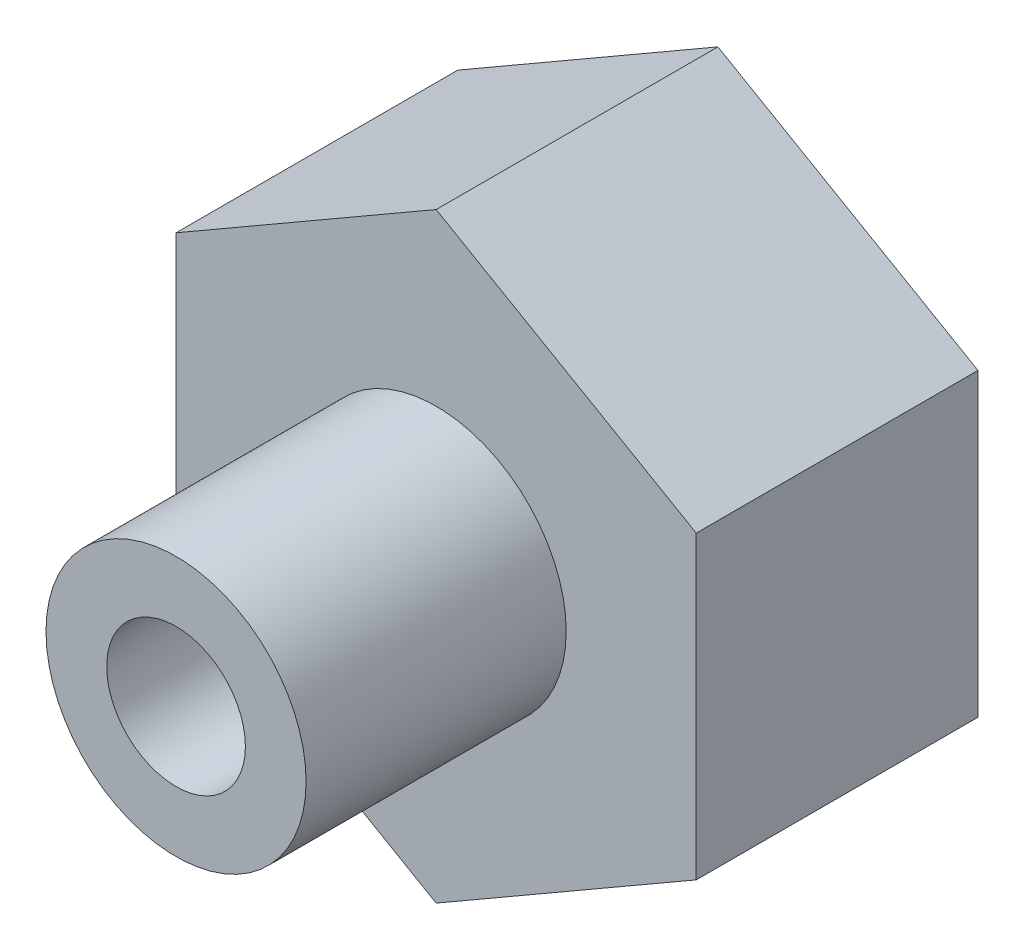
ISO-10303-21;
HEADER;
FILE_DESCRIPTION(('STEP AP214'),'2;1');
FILE_NAME('part.step','',(''),(''),'','','');
FILE_SCHEMA(('AUTOMOTIVE_DESIGN { 1 0 10303 214 1 1 1 1 }'));
ENDSEC;
DATA;
#1=APPLICATION_CONTEXT('core data for automotive mechanical design processes');
#2=APPLICATION_PROTOCOL_DEFINITION('international standard','automotive_design',2000,#1);
#3=PRODUCT_CONTEXT('',#1,'mechanical');
#4=PRODUCT('Part','Part','',(#3));
#5=PRODUCT_RELATED_PRODUCT_CATEGORY('part','',(#4));
#6=PRODUCT_DEFINITION_FORMATION('','',#4);
#7=PRODUCT_DEFINITION_CONTEXT('part definition',#1,'design');
#8=PRODUCT_DEFINITION('design','',#6,#7);
#9=PRODUCT_DEFINITION_SHAPE('','',#8);
#10=(LENGTH_UNIT() NAMED_UNIT(*) SI_UNIT(.MILLI.,.METRE.));
#11=(NAMED_UNIT(*) PLANE_ANGLE_UNIT() SI_UNIT($,.RADIAN.));
#12=(NAMED_UNIT(*) SI_UNIT($,.STERADIAN.) SOLID_ANGLE_UNIT());
#13=UNCERTAINTY_MEASURE_WITH_UNIT(LENGTH_MEASURE(1.E-05),#10,'distance_accuracy_value','');
#14=(GEOMETRIC_REPRESENTATION_CONTEXT(3) GLOBAL_UNCERTAINTY_ASSIGNED_CONTEXT((#13)) GLOBAL_UNIT_ASSIGNED_CONTEXT((#10,
#11,#12)) REPRESENTATION_CONTEXT('',''));
#15=CARTESIAN_POINT('',(0.,0.,0.));
#16=DIRECTION('',(0.,0.,1.));
#17=DIRECTION('',(1.,0.,0.));
#18=AXIS2_PLACEMENT_3D('',#15,#16,#17);
#19=CARTESIAN_POINT('',(12.,-6.92820323027552,13.));
#20=DIRECTION('',(-1.,0.,0.));
#21=DIRECTION('',(0.,-1.,0.));
#22=AXIS2_PLACEMENT_3D('',#19,#20,#21);
#23=PLANE('',#22);
#24=DIRECTION('',(0.,1.,0.));
#25=VECTOR('',#24,1.);
#26=CARTESIAN_POINT('',(12.,-6.92820323027552,0.));
#27=LINE('',#26,#25);
#28=CARTESIAN_POINT('',(12.,-6.92820323027552,0.));
#29=VERTEX_POINT('',#28);
#30=CARTESIAN_POINT('',(12.,6.92820323027551,0.));
#31=VERTEX_POINT('',#30);
#32=EDGE_CURVE('E137',#29,#31,#27,.T.);
#33=ORIENTED_EDGE('',*,*,#32,.T.);
#34=DIRECTION('',(0.,0.,-1.));
#35=VECTOR('',#34,1.);
#36=CARTESIAN_POINT('',(12.,6.92820323027551,13.));
#37=LINE('',#36,#35);
#38=CARTESIAN_POINT('',(12.,6.92820323027551,13.));
#39=VERTEX_POINT('',#38);
#40=EDGE_CURVE('E48',#39,#31,#37,.T.);
#41=ORIENTED_EDGE('',*,*,#40,.F.);
#42=DIRECTION('',(0.,1.,0.));
#43=VECTOR('',#42,1.);
#44=CARTESIAN_POINT('',(12.,-6.92820323027552,13.));
#45=LINE('',#44,#43);
#46=CARTESIAN_POINT('',(12.,-6.92820323027552,13.));
#47=VERTEX_POINT('',#46);
#48=EDGE_CURVE('E153',#47,#39,#45,.T.);
#49=ORIENTED_EDGE('',*,*,#48,.F.);
#50=DIRECTION('',(0.,0.,-1.));
#51=VECTOR('',#50,1.);
#52=CARTESIAN_POINT('',(12.,-6.92820323027552,13.));
#53=LINE('',#52,#51);
#54=EDGE_CURVE('E134',#47,#29,#53,.T.);
#55=ORIENTED_EDGE('',*,*,#54,.T.);
#56=EDGE_LOOP('',(#33,#41,#49,#55));
#57=FACE_BOUND('',#56,.T.);
#58=ADVANCED_FACE('F44',(#57),#23,.F.);
#59=CARTESIAN_POINT('',(12.,6.92820323027551,13.));
#60=DIRECTION('',(-0.5,-0.866025403784439,0.));
#61=DIRECTION('',(0.866025403784439,-0.5,0.));
#62=AXIS2_PLACEMENT_3D('',#59,#60,#61);
#63=PLANE('',#62);
#64=DIRECTION('',(-0.866025403784439,0.5,0.));
#65=VECTOR('',#64,1.);
#66=CARTESIAN_POINT('',(12.,6.92820323027551,0.));
#67=LINE('',#66,#65);
#68=CARTESIAN_POINT('',(0.,13.856406460551,0.));
#69=VERTEX_POINT('',#68);
#70=EDGE_CURVE('E138',#31,#69,#67,.T.);
#71=ORIENTED_EDGE('',*,*,#70,.T.);
#72=DIRECTION('',(0.,0.,-1.));
#73=VECTOR('',#72,1.);
#74=CARTESIAN_POINT('',(0.,13.856406460551,13.));
#75=LINE('',#74,#73);
#76=CARTESIAN_POINT('',(0.,13.856406460551,13.));
#77=VERTEX_POINT('',#76);
#78=EDGE_CURVE('E157',#77,#69,#75,.T.);
#79=ORIENTED_EDGE('',*,*,#78,.F.);
#80=DIRECTION('',(-0.866025403784439,0.5,0.));
#81=VECTOR('',#80,1.);
#82=CARTESIAN_POINT('',(12.,6.92820323027551,13.));
#83=LINE('',#82,#81);
#84=EDGE_CURVE('E101',#39,#77,#83,.T.);
#85=ORIENTED_EDGE('',*,*,#84,.F.);
#86=ORIENTED_EDGE('',*,*,#40,.T.);
#87=EDGE_LOOP('',(#71,#79,#85,#86));
#88=FACE_BOUND('',#87,.T.);
#89=ADVANCED_FACE('F167',(#88),#63,.F.);
#90=CARTESIAN_POINT('',(0.,13.856406460551,13.));
#91=DIRECTION('',(0.5,-0.866025403784439,0.));
#92=DIRECTION('',(0.866025403784439,0.5,0.));
#93=AXIS2_PLACEMENT_3D('',#90,#91,#92);
#94=PLANE('',#93);
#95=DIRECTION('',(-0.866025403784439,-0.5,0.));
#96=VECTOR('',#95,1.);
#97=CARTESIAN_POINT('',(0.,13.856406460551,0.));
#98=LINE('',#97,#96);
#99=CARTESIAN_POINT('',(-12.,6.92820323027551,0.));
#100=VERTEX_POINT('',#99);
#101=EDGE_CURVE('E145',#69,#100,#98,.T.);
#102=ORIENTED_EDGE('',*,*,#101,.T.);
#103=DIRECTION('',(0.,0.,-1.));
#104=VECTOR('',#103,1.);
#105=CARTESIAN_POINT('',(-12.,6.92820323027551,13.));
#106=LINE('',#105,#104);
#107=CARTESIAN_POINT('',(-12.,6.92820323027551,13.));
#108=VERTEX_POINT('',#107);
#109=EDGE_CURVE('E123',#108,#100,#106,.T.);
#110=ORIENTED_EDGE('',*,*,#109,.F.);
#111=DIRECTION('',(-0.866025403784439,-0.5,0.));
#112=VECTOR('',#111,1.);
#113=CARTESIAN_POINT('',(0.,13.856406460551,13.));
#114=LINE('',#113,#112);
#115=EDGE_CURVE('E111',#77,#108,#114,.T.);
#116=ORIENTED_EDGE('',*,*,#115,.F.);
#117=ORIENTED_EDGE('',*,*,#78,.T.);
#118=EDGE_LOOP('',(#102,#110,#116,#117));
#119=FACE_BOUND('',#118,.T.);
#120=ADVANCED_FACE('F174',(#119),#94,.F.);
#121=CARTESIAN_POINT('',(-12.,6.92820323027551,13.));
#122=DIRECTION('',(1.,0.,0.));
#123=DIRECTION('',(0.,1.,0.));
#124=AXIS2_PLACEMENT_3D('',#121,#122,#123);
#125=PLANE('',#124);
#126=DIRECTION('',(0.,-1.,0.));
#127=VECTOR('',#126,1.);
#128=CARTESIAN_POINT('',(-12.,6.92820323027551,0.));
#129=LINE('',#128,#127);
#130=CARTESIAN_POINT('',(-12.,-6.92820323027551,0.));
#131=VERTEX_POINT('',#130);
#132=EDGE_CURVE('E124',#100,#131,#129,.T.);
#133=ORIENTED_EDGE('',*,*,#132,.T.);
#134=DIRECTION('',(0.,0.,-1.));
#135=VECTOR('',#134,1.);
#136=CARTESIAN_POINT('',(-12.,-6.92820323027551,13.));
#137=LINE('',#136,#135);
#138=CARTESIAN_POINT('',(-12.,-6.92820323027551,13.));
#139=VERTEX_POINT('',#138);
#140=EDGE_CURVE('E116',#139,#131,#137,.T.);
#141=ORIENTED_EDGE('',*,*,#140,.F.);
#142=DIRECTION('',(0.,-1.,0.));
#143=VECTOR('',#142,1.);
#144=CARTESIAN_POINT('',(-12.,6.92820323027551,13.));
#145=LINE('',#144,#143);
#146=EDGE_CURVE('E107',#108,#139,#145,.T.);
#147=ORIENTED_EDGE('',*,*,#146,.F.);
#148=ORIENTED_EDGE('',*,*,#109,.T.);
#149=EDGE_LOOP('',(#133,#141,#147,#148));
#150=FACE_BOUND('',#149,.T.);
#151=ADVANCED_FACE('F122',(#150),#125,.F.);
#152=CARTESIAN_POINT('',(-12.,-6.92820323027551,13.));
#153=DIRECTION('',(0.5,0.866025403784439,0.));
#154=DIRECTION('',(-0.866025403784439,0.5,0.));
#155=AXIS2_PLACEMENT_3D('',#152,#153,#154);
#156=PLANE('',#155);
#157=DIRECTION('',(0.866025403784439,-0.5,0.));
#158=VECTOR('',#157,1.);
#159=CARTESIAN_POINT('',(-12.,-6.92820323027551,0.));
#160=LINE('',#159,#158);
#161=CARTESIAN_POINT('',(0.,-13.856406460551,0.));
#162=VERTEX_POINT('',#161);
#163=EDGE_CURVE('E88',#131,#162,#160,.T.);
#164=ORIENTED_EDGE('',*,*,#163,.T.);
#165=DIRECTION('',(0.,0.,-1.));
#166=VECTOR('',#165,1.);
#167=CARTESIAN_POINT('',(0.,-13.856406460551,13.));
#168=LINE('',#167,#166);
#169=CARTESIAN_POINT('',(0.,-13.856406460551,13.));
#170=VERTEX_POINT('',#169);
#171=EDGE_CURVE('E127',#170,#162,#168,.T.);
#172=ORIENTED_EDGE('',*,*,#171,.F.);
#173=DIRECTION('',(0.866025403784439,-0.5,0.));
#174=VECTOR('',#173,1.);
#175=CARTESIAN_POINT('',(-12.,-6.92820323027551,13.));
#176=LINE('',#175,#174);
#177=EDGE_CURVE('E115',#139,#170,#176,.T.);
#178=ORIENTED_EDGE('',*,*,#177,.F.);
#179=ORIENTED_EDGE('',*,*,#140,.T.);
#180=EDGE_LOOP('',(#164,#172,#178,#179));
#181=FACE_BOUND('',#180,.T.);
#182=ADVANCED_FACE('F126',(#181),#156,.F.);
#183=CARTESIAN_POINT('',(0.,-13.856406460551,13.));
#184=DIRECTION('',(-0.5,0.866025403784439,0.));
#185=DIRECTION('',(-0.866025403784439,-0.5,0.));
#186=AXIS2_PLACEMENT_3D('',#183,#184,#185);
#187=PLANE('',#186);
#188=DIRECTION('',(0.866025403784439,0.5,0.));
#189=VECTOR('',#188,1.);
#190=CARTESIAN_POINT('',(0.,-13.856406460551,0.));
#191=LINE('',#190,#189);
#192=EDGE_CURVE('E95',#162,#29,#191,.T.);
#193=ORIENTED_EDGE('',*,*,#192,.T.);
#194=ORIENTED_EDGE('',*,*,#54,.F.);
#195=DIRECTION('',(0.866025403784439,0.5,0.));
#196=VECTOR('',#195,1.);
#197=CARTESIAN_POINT('',(0.,-13.856406460551,13.));
#198=LINE('',#197,#196);
#199=EDGE_CURVE('E62',#170,#47,#198,.T.);
#200=ORIENTED_EDGE('',*,*,#199,.F.);
#201=ORIENTED_EDGE('',*,*,#171,.T.);
#202=EDGE_LOOP('',(#193,#194,#200,#201));
#203=FACE_BOUND('',#202,.T.);
#204=ADVANCED_FACE('F222',(#203),#187,.F.);
#205=CARTESIAN_POINT('',(0.,0.,13.));
#206=DIRECTION('',(0.,0.,1.));
#207=DIRECTION('',(1.,0.,0.));
#208=AXIS2_PLACEMENT_3D('',#205,#206,#207);
#209=PLANE('',#208);
#210=CARTESIAN_POINT('',(0.,0.,13.));
#211=DIRECTION('',(0.,0.,1.));
#212=DIRECTION('',(1.,0.,0.));
#213=AXIS2_PLACEMENT_3D('',#210,#211,#212);
#214=CIRCLE('',#213,6.);
#215=CARTESIAN_POINT('',(6.,0.,13.));
#216=VERTEX_POINT('',#215);
#217=EDGE_CURVE('E11',#216,#216,#214,.T.);
#218=ORIENTED_EDGE('',*,*,#217,.F.);
#219=EDGE_LOOP('',(#218));
#220=FACE_BOUND('',#219,.T.);
#221=ORIENTED_EDGE('',*,*,#48,.T.);
#222=ORIENTED_EDGE('',*,*,#84,.T.);
#223=ORIENTED_EDGE('',*,*,#115,.T.);
#224=ORIENTED_EDGE('',*,*,#146,.T.);
#225=ORIENTED_EDGE('',*,*,#177,.T.);
#226=ORIENTED_EDGE('',*,*,#199,.T.);
#227=EDGE_LOOP('',(#221,#222,#223,#224,#225,#226));
#228=FACE_BOUND('',#227,.T.);
#229=ADVANCED_FACE('F109',(#220,#228),#209,.T.);
#230=CARTESIAN_POINT('',(0.,0.,0.));
#231=DIRECTION('',(0.,0.,1.));
#232=DIRECTION('',(1.,0.,0.));
#233=AXIS2_PLACEMENT_3D('',#230,#231,#232);
#234=PLANE('',#233);
#235=CARTESIAN_POINT('',(0.,0.,0.));
#236=DIRECTION('',(0.,0.,1.));
#237=DIRECTION('',(1.,0.,0.));
#238=AXIS2_PLACEMENT_3D('',#235,#236,#237);
#239=CIRCLE('',#238,10.4775);
#240=CARTESIAN_POINT('',(10.4775,0.,0.));
#241=VERTEX_POINT('',#240);
#242=EDGE_CURVE('E176',#241,#241,#239,.T.);
#243=ORIENTED_EDGE('',*,*,#242,.T.);
#244=EDGE_LOOP('',(#243));
#245=FACE_BOUND('',#244,.T.);
#246=ORIENTED_EDGE('',*,*,#32,.F.);
#247=ORIENTED_EDGE('',*,*,#192,.F.);
#248=ORIENTED_EDGE('',*,*,#163,.F.);
#249=ORIENTED_EDGE('',*,*,#132,.F.);
#250=ORIENTED_EDGE('',*,*,#101,.F.);
#251=ORIENTED_EDGE('',*,*,#70,.F.);
#252=EDGE_LOOP('',(#246,#247,#248,#249,#250,#251));
#253=FACE_BOUND('',#252,.T.);
#254=ADVANCED_FACE('F173',(#245,#253),#234,.F.);
#255=CARTESIAN_POINT('',(0.,0.,11.));
#256=DIRECTION('',(0.,0.,-1.));
#257=DIRECTION('',(-1.,0.,0.));
#258=AXIS2_PLACEMENT_3D('',#255,#256,#257);
#259=CYLINDRICAL_SURFACE('',#258,10.4775);
#260=CARTESIAN_POINT('',(0.,0.,11.));
#261=DIRECTION('',(0.,0.,1.));
#262=DIRECTION('',(1.,0.,0.));
#263=AXIS2_PLACEMENT_3D('',#260,#261,#262);
#264=CIRCLE('',#263,10.4775);
#265=CARTESIAN_POINT('',(10.4775,0.,11.));
#266=VERTEX_POINT('',#265);
#267=EDGE_CURVE('E143',#266,#266,#264,.T.);
#268=ORIENTED_EDGE('',*,*,#267,.T.);
#269=EDGE_LOOP('',(#268));
#270=FACE_BOUND('',#269,.T.);
#271=ORIENTED_EDGE('',*,*,#242,.F.);
#272=EDGE_LOOP('',(#271));
#273=FACE_BOUND('',#272,.T.);
#274=ADVANCED_FACE('F229',(#270,#273),#259,.F.);
#275=CARTESIAN_POINT('',(0.,0.,11.));
#276=DIRECTION('',(0.,0.,1.));
#277=DIRECTION('',(1.,0.,0.));
#278=AXIS2_PLACEMENT_3D('',#275,#276,#277);
#279=PLANE('',#278);
#280=ORIENTED_EDGE('',*,*,#267,.F.);
#281=EDGE_LOOP('',(#280));
#282=FACE_BOUND('',#281,.T.);
#283=ADVANCED_FACE('F216',(#282),#279,.F.);
#284=CARTESIAN_POINT('',(0.,0.,25.));
#285=DIRECTION('',(0.,0.,-1.));
#286=DIRECTION('',(-1.,0.,0.));
#287=AXIS2_PLACEMENT_3D('',#284,#285,#286);
#288=CYLINDRICAL_SURFACE('',#287,6.);
#289=CARTESIAN_POINT('',(0.,0.,25.));
#290=DIRECTION('',(0.,0.,1.));
#291=DIRECTION('',(1.,0.,0.));
#292=AXIS2_PLACEMENT_3D('',#289,#290,#291);
#293=CIRCLE('',#292,6.);
#294=CARTESIAN_POINT('',(6.,0.,25.));
#295=VERTEX_POINT('',#294);
#296=EDGE_CURVE('E181',#295,#295,#293,.T.);
#297=ORIENTED_EDGE('',*,*,#296,.F.);
#298=EDGE_LOOP('',(#297));
#299=FACE_BOUND('',#298,.T.);
#300=ORIENTED_EDGE('',*,*,#217,.T.);
#301=EDGE_LOOP('',(#300));
#302=FACE_BOUND('',#301,.T.);
#303=ADVANCED_FACE('F209',(#299,#302),#288,.T.);
#304=CARTESIAN_POINT('',(0.,0.,25.));
#305=DIRECTION('',(0.,0.,1.));
#306=DIRECTION('',(1.,0.,0.));
#307=AXIS2_PLACEMENT_3D('',#304,#305,#306);
#308=PLANE('',#307);
#309=CARTESIAN_POINT('',(0.,0.,25.));
#310=DIRECTION('',(0.,0.,1.));
#311=DIRECTION('',(1.,0.,0.));
#312=AXIS2_PLACEMENT_3D('',#309,#310,#311);
#313=CIRCLE('',#312,3.2);
#314=CARTESIAN_POINT('',(3.2,0.,25.));
#315=VERTEX_POINT('',#314);
#316=EDGE_CURVE('E192',#315,#315,#313,.T.);
#317=ORIENTED_EDGE('',*,*,#316,.F.);
#318=EDGE_LOOP('',(#317));
#319=FACE_BOUND('',#318,.T.);
#320=ORIENTED_EDGE('',*,*,#296,.T.);
#321=EDGE_LOOP('',(#320));
#322=FACE_BOUND('',#321,.T.);
#323=ADVANCED_FACE('F204',(#319,#322),#308,.T.);
#324=CARTESIAN_POINT('',(0.,0.,15.));
#325=DIRECTION('',(0.,0.,1.));
#326=DIRECTION('',(1.,0.,0.));
#327=AXIS2_PLACEMENT_3D('',#324,#325,#326);
#328=CYLINDRICAL_SURFACE('',#327,3.2);
#329=CARTESIAN_POINT('',(0.,0.,15.));
#330=DIRECTION('',(0.,0.,1.));
#331=DIRECTION('',(1.,0.,0.));
#332=AXIS2_PLACEMENT_3D('',#329,#330,#331);
#333=CIRCLE('',#332,3.2);
#334=CARTESIAN_POINT('',(3.2,0.,15.));
#335=VERTEX_POINT('',#334);
#336=EDGE_CURVE('E186',#335,#335,#333,.T.);
#337=ORIENTED_EDGE('',*,*,#336,.F.);
#338=EDGE_LOOP('',(#337));
#339=FACE_BOUND('',#338,.T.);
#340=ORIENTED_EDGE('',*,*,#316,.T.);
#341=EDGE_LOOP('',(#340));
#342=FACE_BOUND('',#341,.T.);
#343=ADVANCED_FACE('F203',(#339,#342),#328,.F.);
#344=CARTESIAN_POINT('',(0.,0.,15.));
#345=DIRECTION('',(0.,0.,1.));
#346=DIRECTION('',(1.,0.,0.));
#347=AXIS2_PLACEMENT_3D('',#344,#345,#346);
#348=PLANE('',#347);
#349=ORIENTED_EDGE('',*,*,#336,.T.);
#350=EDGE_LOOP('',(#349));
#351=FACE_BOUND('',#350,.T.);
#352=ADVANCED_FACE('F200',(#351),#348,.T.);
#353=CLOSED_SHELL('',(#58,#89,#120,#151,#182,#204,#229,#254,#274,#283,#303,#323,#343,#352));
#354=MANIFOLD_SOLID_BREP('B2',#353);
#355=ADVANCED_BREP_SHAPE_REPRESENTATION('',(#18,#354),#14);
#356=SHAPE_DEFINITION_REPRESENTATION(#9,#355);
ENDSEC;
END-ISO-10303-21;
